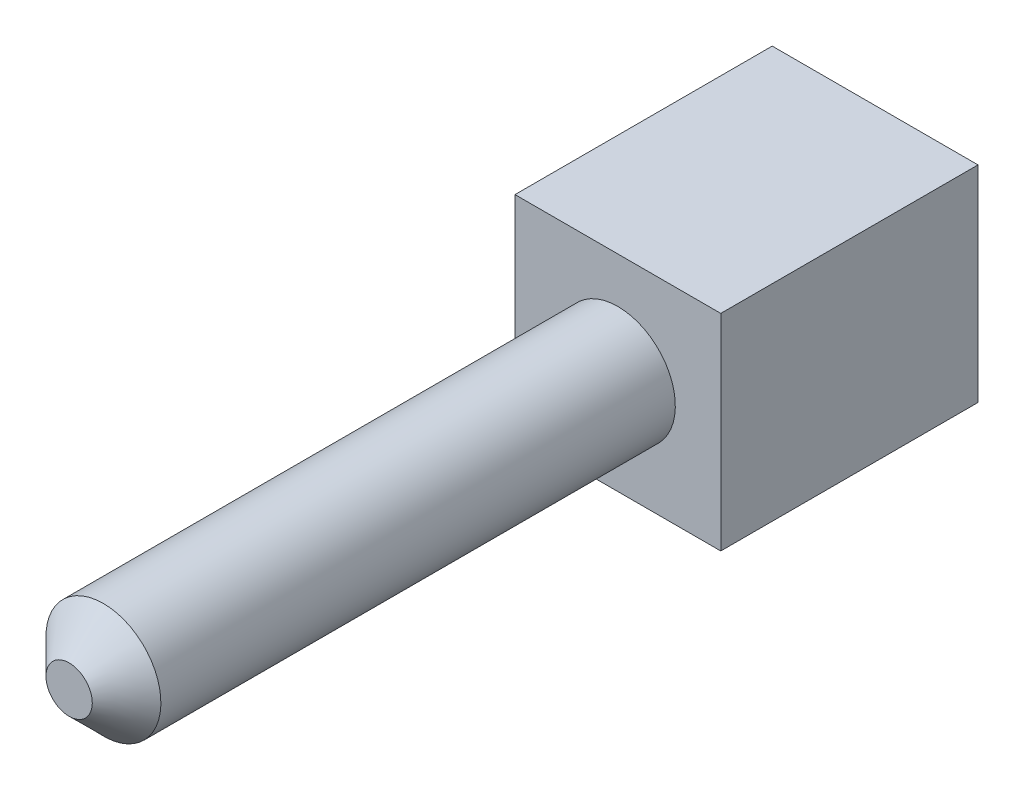
ISO-10303-21;
HEADER;
FILE_DESCRIPTION(('STEP AP214'),'2;1');
FILE_NAME('part.step','',(''),(''),'','','');
FILE_SCHEMA(('AUTOMOTIVE_DESIGN { 1 0 10303 214 1 1 1 1 }'));
ENDSEC;
DATA;
#1=APPLICATION_CONTEXT('core data for automotive mechanical design processes');
#2=APPLICATION_PROTOCOL_DEFINITION('international standard','automotive_design',2000,#1);
#3=PRODUCT_CONTEXT('',#1,'mechanical');
#4=PRODUCT('Part','Part','',(#3));
#5=PRODUCT_RELATED_PRODUCT_CATEGORY('part','',(#4));
#6=PRODUCT_DEFINITION_FORMATION('','',#4);
#7=PRODUCT_DEFINITION_CONTEXT('part definition',#1,'design');
#8=PRODUCT_DEFINITION('design','',#6,#7);
#9=PRODUCT_DEFINITION_SHAPE('','',#8);
#10=(LENGTH_UNIT() NAMED_UNIT(*) SI_UNIT(.MILLI.,.METRE.));
#11=(NAMED_UNIT(*) PLANE_ANGLE_UNIT() SI_UNIT($,.RADIAN.));
#12=(NAMED_UNIT(*) SI_UNIT($,.STERADIAN.) SOLID_ANGLE_UNIT());
#13=UNCERTAINTY_MEASURE_WITH_UNIT(LENGTH_MEASURE(1.E-05),#10,'distance_accuracy_value','');
#14=(GEOMETRIC_REPRESENTATION_CONTEXT(3) GLOBAL_UNCERTAINTY_ASSIGNED_CONTEXT((#13)) GLOBAL_UNIT_ASSIGNED_CONTEXT((#10,
#11,#12)) REPRESENTATION_CONTEXT('',''));
#15=CARTESIAN_POINT('',(0.,0.,0.));
#16=DIRECTION('',(0.,0.,1.));
#17=DIRECTION('',(1.,0.,0.));
#18=AXIS2_PLACEMENT_3D('',#15,#16,#17);
#19=CARTESIAN_POINT('',(-6.128826208725,11.029000078524,-3.));
#20=DIRECTION('',(0.,-1.,0.));
#21=DIRECTION('',(-1.,0.,0.));
#22=AXIS2_PLACEMENT_3D('',#19,#20,#21);
#23=PLANE('',#22);
#24=DIRECTION('',(1.,0.,0.));
#25=VECTOR('',#24,1.);
#26=CARTESIAN_POINT('',(-6.128826208725,11.029000078524,-1.5));
#27=LINE('',#26,#25);
#28=CARTESIAN_POINT('',(-6.728826208725,11.029000078524,-1.5));
#29=VERTEX_POINT('',#28);
#30=CARTESIAN_POINT('',(-5.528826208725,11.029000078524,-1.5));
#31=VERTEX_POINT('',#30);
#32=EDGE_CURVE('E108',#29,#31,#27,.T.);
#33=ORIENTED_EDGE('',*,*,#32,.F.);
#34=DIRECTION('',(0.,0.,1.));
#35=VECTOR('',#34,1.);
#36=CARTESIAN_POINT('',(-6.728826208725,11.029000078524,-3.));
#37=LINE('',#36,#35);
#38=CARTESIAN_POINT('',(-6.728826208725,11.029000078524,-3.));
#39=VERTEX_POINT('',#38);
#40=EDGE_CURVE('E11',#39,#29,#37,.T.);
#41=ORIENTED_EDGE('',*,*,#40,.F.);
#42=DIRECTION('',(1.,0.,0.));
#43=VECTOR('',#42,1.);
#44=CARTESIAN_POINT('',(-6.128826208725,11.029000078524,-3.));
#45=LINE('',#44,#43);
#46=CARTESIAN_POINT('',(-5.528826208725,11.029000078524,-3.));
#47=VERTEX_POINT('',#46);
#48=EDGE_CURVE('E122',#39,#47,#45,.T.);
#49=ORIENTED_EDGE('',*,*,#48,.T.);
#50=DIRECTION('',(0.,0.,1.));
#51=VECTOR('',#50,1.);
#52=CARTESIAN_POINT('',(-5.528826208725,11.029000078524,-3.));
#53=LINE('',#52,#51);
#54=EDGE_CURVE('E131',#47,#31,#53,.T.);
#55=ORIENTED_EDGE('',*,*,#54,.T.);
#56=EDGE_LOOP('',(#33,#41,#49,#55));
#57=FACE_BOUND('',#56,.T.);
#58=ADVANCED_FACE('F17',(#57),#23,.T.);
#59=CARTESIAN_POINT('',(-6.728826208725,11.629000078524,-3.));
#60=DIRECTION('',(1.,0.,0.));
#61=DIRECTION('',(0.,-1.,0.));
#62=AXIS2_PLACEMENT_3D('',#59,#60,#61);
#63=PLANE('',#62);
#64=DIRECTION('',(0.,1.,0.));
#65=VECTOR('',#64,1.);
#66=CARTESIAN_POINT('',(-6.728826208725,11.629000078524,-1.5));
#67=LINE('',#66,#65);
#68=CARTESIAN_POINT('',(-6.728826208725,12.229000078524,-1.5));
#69=VERTEX_POINT('',#68);
#70=EDGE_CURVE('E119',#29,#69,#67,.T.);
#71=ORIENTED_EDGE('',*,*,#70,.T.);
#72=DIRECTION('',(0.,0.,1.));
#73=VECTOR('',#72,1.);
#74=CARTESIAN_POINT('',(-6.728826208725,12.229000078524,-3.));
#75=LINE('',#74,#73);
#76=CARTESIAN_POINT('',(-6.728826208725,12.229000078524,-3.));
#77=VERTEX_POINT('',#76);
#78=EDGE_CURVE('E20',#77,#69,#75,.T.);
#79=ORIENTED_EDGE('',*,*,#78,.F.);
#80=DIRECTION('',(0.,1.,0.));
#81=VECTOR('',#80,1.);
#82=CARTESIAN_POINT('',(-6.728826208725,11.629000078524,-3.));
#83=LINE('',#82,#81);
#84=EDGE_CURVE('E104',#39,#77,#83,.T.);
#85=ORIENTED_EDGE('',*,*,#84,.F.);
#86=ORIENTED_EDGE('',*,*,#40,.T.);
#87=EDGE_LOOP('',(#71,#79,#85,#86));
#88=FACE_BOUND('',#87,.T.);
#89=ADVANCED_FACE('F210',(#88),#63,.F.);
#90=CARTESIAN_POINT('',(-6.128826208725,12.229000078524,-3.));
#91=DIRECTION('',(0.,-1.,0.));
#92=DIRECTION('',(-1.,0.,0.));
#93=AXIS2_PLACEMENT_3D('',#90,#91,#92);
#94=PLANE('',#93);
#95=DIRECTION('',(1.,0.,0.));
#96=VECTOR('',#95,1.);
#97=CARTESIAN_POINT('',(-6.128826208725,12.229000078524,-1.5));
#98=LINE('',#97,#96);
#99=CARTESIAN_POINT('',(-5.528826208725,12.229000078524,-1.5));
#100=VERTEX_POINT('',#99);
#101=EDGE_CURVE('E116',#69,#100,#98,.T.);
#102=ORIENTED_EDGE('',*,*,#101,.T.);
#103=DIRECTION('',(0.,0.,1.));
#104=VECTOR('',#103,1.);
#105=CARTESIAN_POINT('',(-5.528826208725,12.229000078524,-3.));
#106=LINE('',#105,#104);
#107=CARTESIAN_POINT('',(-5.528826208725,12.229000078524,-3.));
#108=VERTEX_POINT('',#107);
#109=EDGE_CURVE('E38',#108,#100,#106,.T.);
#110=ORIENTED_EDGE('',*,*,#109,.F.);
#111=DIRECTION('',(1.,0.,0.));
#112=VECTOR('',#111,1.);
#113=CARTESIAN_POINT('',(-6.128826208725,12.229000078524,-3.));
#114=LINE('',#113,#112);
#115=EDGE_CURVE('E99',#77,#108,#114,.T.);
#116=ORIENTED_EDGE('',*,*,#115,.F.);
#117=ORIENTED_EDGE('',*,*,#78,.T.);
#118=EDGE_LOOP('',(#102,#110,#116,#117));
#119=FACE_BOUND('',#118,.T.);
#120=ADVANCED_FACE('F202',(#119),#94,.F.);
#121=CARTESIAN_POINT('',(-5.528826208725,11.629000078524,-3.));
#122=DIRECTION('',(1.,0.,0.));
#123=DIRECTION('',(0.,-1.,0.));
#124=AXIS2_PLACEMENT_3D('',#121,#122,#123);
#125=PLANE('',#124);
#126=DIRECTION('',(0.,1.,0.));
#127=VECTOR('',#126,1.);
#128=CARTESIAN_POINT('',(-5.528826208725,11.629000078524,-1.5));
#129=LINE('',#128,#127);
#130=EDGE_CURVE('E112',#31,#100,#129,.T.);
#131=ORIENTED_EDGE('',*,*,#130,.F.);
#132=ORIENTED_EDGE('',*,*,#54,.F.);
#133=DIRECTION('',(0.,1.,0.));
#134=VECTOR('',#133,1.);
#135=CARTESIAN_POINT('',(-5.528826208725,11.629000078524,-3.));
#136=LINE('',#135,#134);
#137=EDGE_CURVE('E103',#47,#108,#136,.T.);
#138=ORIENTED_EDGE('',*,*,#137,.T.);
#139=ORIENTED_EDGE('',*,*,#109,.T.);
#140=EDGE_LOOP('',(#131,#132,#138,#139));
#141=FACE_BOUND('',#140,.T.);
#142=ADVANCED_FACE('F193',(#141),#125,.T.);
#143=CARTESIAN_POINT('',(-6.128826208725,11.629000078524,-3.));
#144=DIRECTION('',(0.,0.,-1.));
#145=DIRECTION('',(-1.,0.,0.));
#146=AXIS2_PLACEMENT_3D('',#143,#144,#145);
#147=PLANE('',#146);
#148=ORIENTED_EDGE('',*,*,#48,.F.);
#149=ORIENTED_EDGE('',*,*,#84,.T.);
#150=ORIENTED_EDGE('',*,*,#115,.T.);
#151=ORIENTED_EDGE('',*,*,#137,.F.);
#152=EDGE_LOOP('',(#148,#149,#150,#151));
#153=FACE_BOUND('',#152,.T.);
#154=ADVANCED_FACE('F183',(#153),#147,.T.);
#155=CARTESIAN_POINT('',(-6.128826208725,11.629000078524,-1.5));
#156=DIRECTION('',(0.,0.,-1.));
#157=DIRECTION('',(-1.,0.,0.));
#158=AXIS2_PLACEMENT_3D('',#155,#156,#157);
#159=PLANE('',#158);
#160=CARTESIAN_POINT('',(-6.128826208725,11.629000078524,-1.5));
#161=DIRECTION('',(0.,0.,1.));
#162=DIRECTION('',(0.,1.,0.));
#163=AXIS2_PLACEMENT_3D('',#160,#161,#162);
#164=CIRCLE('',#163,0.335);
#165=CARTESIAN_POINT('',(-6.128826208725,11.964000078524,-1.5));
#166=VERTEX_POINT('',#165);
#167=EDGE_CURVE('E96',#166,#166,#164,.T.);
#168=ORIENTED_EDGE('',*,*,#167,.F.);
#169=EDGE_LOOP('',(#168));
#170=FACE_BOUND('',#169,.T.);
#171=ORIENTED_EDGE('',*,*,#32,.T.);
#172=ORIENTED_EDGE('',*,*,#130,.T.);
#173=ORIENTED_EDGE('',*,*,#101,.F.);
#174=ORIENTED_EDGE('',*,*,#70,.F.);
#175=EDGE_LOOP('',(#171,#172,#173,#174));
#176=FACE_BOUND('',#175,.T.);
#177=ADVANCED_FACE('F173',(#170,#176),#159,.F.);
#178=CARTESIAN_POINT('',(-6.128826208725,11.629000078524,1.7));
#179=DIRECTION('',(0.,0.,-1.));
#180=DIRECTION('',(0.,-1.,0.));
#181=AXIS2_PLACEMENT_3D('',#178,#179,#180);
#182=CYLINDRICAL_SURFACE('',#181,0.335);
#183=CARTESIAN_POINT('',(-6.128826208725,11.629000078524,1.5));
#184=DIRECTION('',(0.,0.,1.));
#185=DIRECTION('',(0.,1.,0.));
#186=AXIS2_PLACEMENT_3D('',#183,#184,#185);
#187=CIRCLE('',#186,0.335);
#188=CARTESIAN_POINT('',(-6.128826208725,11.964000078524,1.5));
#189=VERTEX_POINT('',#188);
#190=EDGE_CURVE('E86',#189,#189,#187,.T.);
#191=ORIENTED_EDGE('',*,*,#190,.F.);
#192=EDGE_LOOP('',(#191));
#193=FACE_BOUND('',#192,.T.);
#194=ORIENTED_EDGE('',*,*,#167,.T.);
#195=EDGE_LOOP('',(#194));
#196=FACE_BOUND('',#195,.T.);
#197=ADVANCED_FACE('F162',(#193,#196),#182,.T.);
#198=CARTESIAN_POINT('',(-6.128826208725,11.629000078524,1.7));
#199=DIRECTION('',(0.,0.,1.));
#200=DIRECTION('',(1.,0.,0.));
#201=AXIS2_PLACEMENT_3D('',#198,#199,#200);
#202=PLANE('',#201);
#203=CARTESIAN_POINT('',(-6.128826208725,11.629000078524,1.7));
#204=DIRECTION('',(0.,0.,1.));
#205=DIRECTION('',(0.,1.,0.));
#206=AXIS2_PLACEMENT_3D('',#203,#204,#205);
#207=CIRCLE('',#206,0.135);
#208=CARTESIAN_POINT('',(-6.128826208725,11.764000078524,1.7));
#209=VERTEX_POINT('',#208);
#210=EDGE_CURVE('E90',#209,#209,#207,.T.);
#211=ORIENTED_EDGE('',*,*,#210,.T.);
#212=EDGE_LOOP('',(#211));
#213=FACE_BOUND('',#212,.T.);
#214=ADVANCED_FACE('F151',(#213),#202,.T.);
#215=CARTESIAN_POINT('',(-6.128826208725,11.629000078524,1.7));
#216=DIRECTION('',(0.,0.,-1.));
#217=DIRECTION('',(0.,-1.,0.));
#218=AXIS2_PLACEMENT_3D('',#215,#216,#217);
#219=CONICAL_SURFACE('',#218,0.135,0.785398163397);
#220=ORIENTED_EDGE('',*,*,#210,.F.);
#221=EDGE_LOOP('',(#220));
#222=FACE_BOUND('',#221,.T.);
#223=ORIENTED_EDGE('',*,*,#190,.T.);
#224=EDGE_LOOP('',(#223));
#225=FACE_BOUND('',#224,.T.);
#226=ADVANCED_FACE('F87',(#222,#225),#219,.T.);
#227=CLOSED_SHELL('',(#58,#89,#120,#142,#154,#177,#197,#214,#226));
#228=MANIFOLD_SOLID_BREP('B1',#227);
#229=ADVANCED_BREP_SHAPE_REPRESENTATION('',(#18,#228),#14);
#230=SHAPE_DEFINITION_REPRESENTATION(#9,#229);
ENDSEC;
END-ISO-10303-21;
